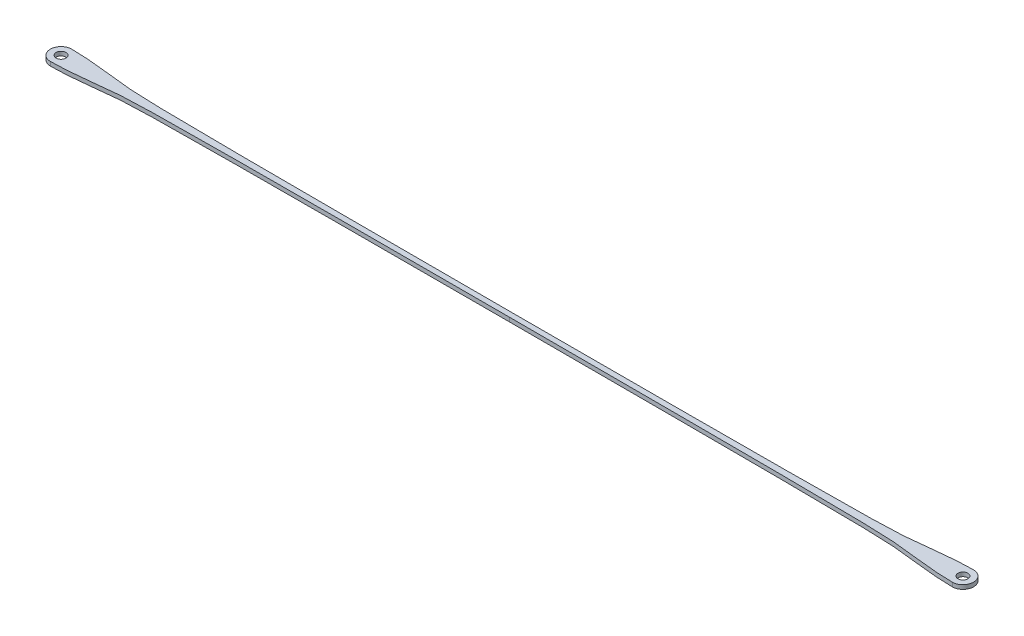
ISO-10303-21;
HEADER;
FILE_DESCRIPTION(('STEP AP214'),'2;1');
FILE_NAME('part.step','',(''),(''),'','','');
FILE_SCHEMA(('AUTOMOTIVE_DESIGN { 1 0 10303 214 1 1 1 1 }'));
ENDSEC;
DATA;
#1=APPLICATION_CONTEXT('core data for automotive mechanical design processes');
#2=APPLICATION_PROTOCOL_DEFINITION('international standard','automotive_design',2000,#1);
#3=PRODUCT_CONTEXT('',#1,'mechanical');
#4=PRODUCT('Part','Part','',(#3));
#5=PRODUCT_RELATED_PRODUCT_CATEGORY('part','',(#4));
#6=PRODUCT_DEFINITION_FORMATION('','',#4);
#7=PRODUCT_DEFINITION_CONTEXT('part definition',#1,'design');
#8=PRODUCT_DEFINITION('design','',#6,#7);
#9=PRODUCT_DEFINITION_SHAPE('','',#8);
#10=(LENGTH_UNIT() NAMED_UNIT(*) SI_UNIT(.MILLI.,.METRE.));
#11=(NAMED_UNIT(*) PLANE_ANGLE_UNIT() SI_UNIT($,.RADIAN.));
#12=(NAMED_UNIT(*) SI_UNIT($,.STERADIAN.) SOLID_ANGLE_UNIT());
#13=UNCERTAINTY_MEASURE_WITH_UNIT(LENGTH_MEASURE(1.E-05),#10,'distance_accuracy_value','');
#14=(GEOMETRIC_REPRESENTATION_CONTEXT(3) GLOBAL_UNCERTAINTY_ASSIGNED_CONTEXT((#13)) GLOBAL_UNIT_ASSIGNED_CONTEXT((#10,
#11,#12)) REPRESENTATION_CONTEXT('',''));
#15=CARTESIAN_POINT('',(0.,0.,0.));
#16=DIRECTION('',(0.,0.,1.));
#17=DIRECTION('',(1.,0.,0.));
#18=AXIS2_PLACEMENT_3D('',#15,#16,#17);
#19=CARTESIAN_POINT('',(0.,0.5,1.30000507237961));
#20=CARTESIAN_POINT('',(2.1582956686711,0.5,1.30000507237961));
#21=CARTESIAN_POINT('',(7.53255802652431,0.5,0.546418398062768));
#22=CARTESIAN_POINT('',(11.223513642314,0.5,0.328258620123109));
#23=CARTESIAN_POINT('',(55.,0.5,0.319066310254357));
#24=B_SPLINE_CURVE_WITH_KNOTS('',3,(#19,#20,#21,#22,#23),.UNSPECIFIED.,.F.,.F.,(4,1,4),(0.,
0.427834461323006,1.),.UNSPECIFIED.);
#25=DIRECTION('',(0.,-1.,0.));
#26=VECTOR('',#25,1.);
#27=SURFACE_OF_LINEAR_EXTRUSION('',#24,#26);
#28=CARTESIAN_POINT('',(0.,0.,1.30000507237961));
#29=CARTESIAN_POINT('',(2.1582956686711,0.,1.30000507237961));
#30=CARTESIAN_POINT('',(7.53255802652431,0.,0.546418398062768));
#31=CARTESIAN_POINT('',(11.223513642314,0.,0.328258620123109));
#32=CARTESIAN_POINT('',(55.,0.,0.319066310254357));
#33=B_SPLINE_CURVE_WITH_KNOTS('',3,(#28,#29,#30,#31,#32),.UNSPECIFIED.,.F.,.F.,(4,1,4),(0.,
0.427834461323006,1.),.UNSPECIFIED.);
#34=CARTESIAN_POINT('',(0.,0.,1.30000507237961));
#35=VERTEX_POINT('',#34);
#36=CARTESIAN_POINT('',(55.,0.,0.319066310254357));
#37=VERTEX_POINT('',#36);
#38=EDGE_CURVE('E230',#35,#37,#33,.T.);
#39=ORIENTED_EDGE('',*,*,#38,.T.);
#40=DIRECTION('',(0.,-1.,0.));
#41=VECTOR('',#40,1.);
#42=CARTESIAN_POINT('',(55.,0.5,0.319066310254357));
#43=LINE('',#42,#41);
#44=CARTESIAN_POINT('',(55.,0.5,0.319066310254357));
#45=VERTEX_POINT('',#44);
#46=EDGE_CURVE('E102',#45,#37,#43,.T.);
#47=ORIENTED_EDGE('',*,*,#46,.F.);
#48=CARTESIAN_POINT('',(0.,0.5,1.30000507237961));
#49=VERTEX_POINT('',#48);
#50=EDGE_CURVE('E225',#49,#45,#24,.T.);
#51=ORIENTED_EDGE('',*,*,#50,.F.);
#52=DIRECTION('',(0.,-1.,0.));
#53=VECTOR('',#52,1.);
#54=CARTESIAN_POINT('',(0.,0.5,1.30000507237961));
#55=LINE('',#54,#53);
#56=EDGE_CURVE('E12',#49,#35,#55,.T.);
#57=ORIENTED_EDGE('',*,*,#56,.T.);
#58=EDGE_LOOP('',(#39,#47,#51,#57));
#59=FACE_BOUND('',#58,.T.);
#60=ADVANCED_FACE('F91',(#59),#27,.F.);
#61=CARTESIAN_POINT('',(0.,0.5,-1.30000507237961));
#62=CARTESIAN_POINT('',(2.1582956686711,0.5,-1.30000507237961));
#63=CARTESIAN_POINT('',(7.5325580265243,0.5,-0.546418398062768));
#64=CARTESIAN_POINT('',(11.223513642314,0.5,-0.32825862012311));
#65=CARTESIAN_POINT('',(55.,0.5,-0.319066310254357));
#66=B_SPLINE_CURVE_WITH_KNOTS('',3,(#61,#62,#63,#64,#65),.UNSPECIFIED.,.F.,.F.,(4,1,4),(0.,
0.427834461323006,1.),.UNSPECIFIED.);
#67=DIRECTION('',(0.,-1.,0.));
#68=VECTOR('',#67,1.);
#69=SURFACE_OF_LINEAR_EXTRUSION('',#66,#68);
#70=CARTESIAN_POINT('',(0.,0.,-1.30000507237961));
#71=CARTESIAN_POINT('',(2.1582956686711,0.,-1.30000507237961));
#72=CARTESIAN_POINT('',(7.5325580265243,0.,-0.546418398062768));
#73=CARTESIAN_POINT('',(11.223513642314,0.,-0.32825862012311));
#74=CARTESIAN_POINT('',(55.,0.,-0.319066310254357));
#75=B_SPLINE_CURVE_WITH_KNOTS('',3,(#70,#71,#72,#73,#74),.UNSPECIFIED.,.F.,.F.,(4,1,4),(0.,
0.427834461323006,1.),.UNSPECIFIED.);
#76=CARTESIAN_POINT('',(0.,0.,-1.30000507237961));
#77=VERTEX_POINT('',#76);
#78=CARTESIAN_POINT('',(55.,0.,-0.319066310254357));
#79=VERTEX_POINT('',#78);
#80=EDGE_CURVE('E169',#77,#79,#75,.T.);
#81=ORIENTED_EDGE('',*,*,#80,.F.);
#82=DIRECTION('',(0.,-1.,0.));
#83=VECTOR('',#82,1.);
#84=CARTESIAN_POINT('',(0.,0.5,-1.30000507237961));
#85=LINE('',#84,#83);
#86=CARTESIAN_POINT('',(0.,0.5,-1.30000507237961));
#87=VERTEX_POINT('',#86);
#88=EDGE_CURVE('E111',#87,#77,#85,.T.);
#89=ORIENTED_EDGE('',*,*,#88,.F.);
#90=CARTESIAN_POINT('',(55.,0.5,-0.319066310254357));
#91=VERTEX_POINT('',#90);
#92=EDGE_CURVE('E219',#87,#91,#66,.T.);
#93=ORIENTED_EDGE('',*,*,#92,.T.);
#94=DIRECTION('',(0.,-1.,0.));
#95=VECTOR('',#94,1.);
#96=CARTESIAN_POINT('',(55.,0.5,-0.319066310254357));
#97=LINE('',#96,#95);
#98=EDGE_CURVE('E122',#91,#79,#97,.T.);
#99=ORIENTED_EDGE('',*,*,#98,.T.);
#100=EDGE_LOOP('',(#81,#89,#93,#99));
#101=FACE_BOUND('',#100,.T.);
#102=ADVANCED_FACE('F214',(#101),#69,.T.);
#103=CARTESIAN_POINT('',(0.,0.,0.));
#104=DIRECTION('',(0.,1.,0.));
#105=DIRECTION('',(0.,0.,1.));
#106=AXIS2_PLACEMENT_3D('',#103,#104,#105);
#107=PLANE('',#106);
#108=CARTESIAN_POINT('',(110.,0.,0.));
#109=DIRECTION('',(0.,1.,0.));
#110=DIRECTION('',(0.,0.,1.));
#111=AXIS2_PLACEMENT_3D('',#108,#109,#110);
#112=CIRCLE('',#111,0.6);
#113=CARTESIAN_POINT('',(110.,0.,0.6));
#114=VERTEX_POINT('',#113);
#115=EDGE_CURVE('E177',#114,#114,#112,.F.);
#116=ORIENTED_EDGE('',*,*,#115,.F.);
#117=EDGE_LOOP('',(#116));
#118=FACE_BOUND('',#117,.T.);
#119=CARTESIAN_POINT('',(0.,0.,0.));
#120=DIRECTION('',(0.,1.,0.));
#121=DIRECTION('',(0.,0.,1.));
#122=AXIS2_PLACEMENT_3D('',#119,#120,#121);
#123=CIRCLE('',#122,0.6);
#124=CARTESIAN_POINT('',(0.,0.,0.6));
#125=VERTEX_POINT('',#124);
#126=EDGE_CURVE('E260',#125,#125,#123,.T.);
#127=ORIENTED_EDGE('',*,*,#126,.T.);
#128=EDGE_LOOP('',(#127));
#129=FACE_BOUND('',#128,.T.);
#130=ORIENTED_EDGE('',*,*,#38,.F.);
#131=CARTESIAN_POINT('',(0.,0.,0.));
#132=DIRECTION('',(0.,1.,0.));
#133=DIRECTION('',(0.,0.,1.));
#134=AXIS2_PLACEMENT_3D('',#131,#132,#133);
#135=CIRCLE('',#134,1.30000507237961);
#136=EDGE_CURVE('E95',#77,#35,#135,.T.);
#137=ORIENTED_EDGE('',*,*,#136,.F.);
#138=ORIENTED_EDGE('',*,*,#80,.T.);
#139=CARTESIAN_POINT('',(110.,0.,-1.30000507237961));
#140=CARTESIAN_POINT('',(107.841704331329,0.,-1.30000507237961));
#141=CARTESIAN_POINT('',(102.467441973476,0.,-0.546418398062768));
#142=CARTESIAN_POINT('',(98.776486357686,0.,-0.32825862012311));
#143=CARTESIAN_POINT('',(55.,0.,-0.319066310254357));
#144=B_SPLINE_CURVE_WITH_KNOTS('',3,(#139,#140,#141,#142,#143),.UNSPECIFIED.,.F.,.F.,(4,1,4),
(0.,0.427834461323006,1.),.UNSPECIFIED.);
#145=CARTESIAN_POINT('',(110.,0.,-1.30000507237961));
#146=VERTEX_POINT('',#145);
#147=EDGE_CURVE('E152',#146,#79,#144,.T.);
#148=ORIENTED_EDGE('',*,*,#147,.F.);
#149=CARTESIAN_POINT('',(110.,0.,0.));
#150=DIRECTION('',(0.,-1.,0.));
#151=DIRECTION('',(0.,0.,1.));
#152=AXIS2_PLACEMENT_3D('',#149,#150,#151);
#153=CIRCLE('',#152,1.30000507237961);
#154=CARTESIAN_POINT('',(110.,0.,1.30000507237961));
#155=VERTEX_POINT('',#154);
#156=EDGE_CURVE('E168',#146,#155,#153,.T.);
#157=ORIENTED_EDGE('',*,*,#156,.T.);
#158=CARTESIAN_POINT('',(110.,0.,1.30000507237961));
#159=CARTESIAN_POINT('',(107.841704331329,0.,1.30000507237961));
#160=CARTESIAN_POINT('',(102.467441973476,0.,0.546418398062768));
#161=CARTESIAN_POINT('',(98.776486357686,0.,0.328258620123109));
#162=CARTESIAN_POINT('',(55.,0.,0.319066310254357));
#163=B_SPLINE_CURVE_WITH_KNOTS('',3,(#158,#159,#160,#161,#162),.UNSPECIFIED.,.F.,.F.,(4,1,4),
(0.,0.427834461323006,1.),.UNSPECIFIED.);
#164=EDGE_CURVE('E171',#155,#37,#163,.T.);
#165=ORIENTED_EDGE('',*,*,#164,.T.);
#166=EDGE_LOOP('',(#130,#137,#138,#148,#157,#165));
#167=FACE_BOUND('',#166,.T.);
#168=ADVANCED_FACE('F166',(#118,#129,#167),#107,.F.);
#169=CARTESIAN_POINT('',(0.,0.5,0.));
#170=DIRECTION('',(0.,1.,0.));
#171=DIRECTION('',(0.,0.,1.));
#172=AXIS2_PLACEMENT_3D('',#169,#170,#171);
#173=PLANE('',#172);
#174=CARTESIAN_POINT('',(110.,0.5,0.));
#175=DIRECTION('',(0.,-1.,0.));
#176=DIRECTION('',(0.,0.,1.));
#177=AXIS2_PLACEMENT_3D('',#174,#175,#176);
#178=CIRCLE('',#177,0.6);
#179=CARTESIAN_POINT('',(110.,0.5,0.6));
#180=VERTEX_POINT('',#179);
#181=EDGE_CURVE('E183',#180,#180,#178,.T.);
#182=ORIENTED_EDGE('',*,*,#181,.T.);
#183=EDGE_LOOP('',(#182));
#184=FACE_BOUND('',#183,.T.);
#185=CARTESIAN_POINT('',(0.,0.5,0.));
#186=DIRECTION('',(0.,1.,0.));
#187=DIRECTION('',(0.,0.,1.));
#188=AXIS2_PLACEMENT_3D('',#185,#186,#187);
#189=CIRCLE('',#188,0.6);
#190=CARTESIAN_POINT('',(0.,0.5,0.6));
#191=VERTEX_POINT('',#190);
#192=EDGE_CURVE('E160',#191,#191,#189,.T.);
#193=ORIENTED_EDGE('',*,*,#192,.F.);
#194=EDGE_LOOP('',(#193));
#195=FACE_BOUND('',#194,.T.);
#196=ORIENTED_EDGE('',*,*,#92,.F.);
#197=CARTESIAN_POINT('',(0.,0.5,0.));
#198=DIRECTION('',(0.,1.,0.));
#199=DIRECTION('',(0.,0.,1.));
#200=AXIS2_PLACEMENT_3D('',#197,#198,#199);
#201=CIRCLE('',#200,1.30000507237961);
#202=EDGE_CURVE('E238',#87,#49,#201,.T.);
#203=ORIENTED_EDGE('',*,*,#202,.T.);
#204=ORIENTED_EDGE('',*,*,#50,.T.);
#205=CARTESIAN_POINT('',(110.,0.5,1.30000507237961));
#206=CARTESIAN_POINT('',(107.841704331329,0.5,1.30000507237961));
#207=CARTESIAN_POINT('',(102.467441973476,0.5,0.546418398062768));
#208=CARTESIAN_POINT('',(98.776486357686,0.5,0.328258620123109));
#209=CARTESIAN_POINT('',(55.,0.5,0.319066310254357));
#210=B_SPLINE_CURVE_WITH_KNOTS('',3,(#205,#206,#207,#208,#209),.UNSPECIFIED.,.F.,.F.,(4,1,4),
(0.,0.427834461323006,1.),.UNSPECIFIED.);
#211=CARTESIAN_POINT('',(110.,0.5,1.30000507237961));
#212=VERTEX_POINT('',#211);
#213=EDGE_CURVE('E191',#212,#45,#210,.T.);
#214=ORIENTED_EDGE('',*,*,#213,.F.);
#215=CARTESIAN_POINT('',(110.,0.5,0.));
#216=DIRECTION('',(0.,-1.,0.));
#217=DIRECTION('',(0.,0.,1.));
#218=AXIS2_PLACEMENT_3D('',#215,#216,#217);
#219=CIRCLE('',#218,1.30000507237961);
#220=CARTESIAN_POINT('',(110.,0.5,-1.30000507237961));
#221=VERTEX_POINT('',#220);
#222=EDGE_CURVE('E172',#221,#212,#219,.T.);
#223=ORIENTED_EDGE('',*,*,#222,.F.);
#224=CARTESIAN_POINT('',(110.,0.5,-1.30000507237961));
#225=CARTESIAN_POINT('',(107.841704331329,0.5,-1.30000507237961));
#226=CARTESIAN_POINT('',(102.467441973476,0.5,-0.546418398062768));
#227=CARTESIAN_POINT('',(98.776486357686,0.5,-0.32825862012311));
#228=CARTESIAN_POINT('',(55.,0.5,-0.319066310254357));
#229=B_SPLINE_CURVE_WITH_KNOTS('',3,(#224,#225,#226,#227,#228),.UNSPECIFIED.,.F.,.F.,(4,1,4),
(0.,0.427834461323006,1.),.UNSPECIFIED.);
#230=EDGE_CURVE('E154',#221,#91,#229,.T.);
#231=ORIENTED_EDGE('',*,*,#230,.T.);
#232=EDGE_LOOP('',(#196,#203,#204,#214,#223,#231));
#233=FACE_BOUND('',#232,.T.);
#234=ADVANCED_FACE('F208',(#184,#195,#233),#173,.T.);
#235=CARTESIAN_POINT('',(0.,0.5,0.));
#236=DIRECTION('',(0.,-1.,0.));
#237=DIRECTION('',(0.,0.,-1.));
#238=AXIS2_PLACEMENT_3D('',#235,#236,#237);
#239=CYLINDRICAL_SURFACE('',#238,1.30000507237961);
#240=ORIENTED_EDGE('',*,*,#56,.F.);
#241=ORIENTED_EDGE('',*,*,#202,.F.);
#242=ORIENTED_EDGE('',*,*,#88,.T.);
#243=ORIENTED_EDGE('',*,*,#136,.T.);
#244=EDGE_LOOP('',(#240,#241,#242,#243));
#245=FACE_BOUND('',#244,.T.);
#246=ADVANCED_FACE('F93',(#245),#239,.T.);
#247=CARTESIAN_POINT('',(0.,-0.5,0.));
#248=DIRECTION('',(0.,1.,0.));
#249=DIRECTION('',(0.,0.,1.));
#250=AXIS2_PLACEMENT_3D('',#247,#248,#249);
#251=CYLINDRICAL_SURFACE('',#250,0.6);
#252=ORIENTED_EDGE('',*,*,#192,.T.);
#253=EDGE_LOOP('',(#252));
#254=FACE_BOUND('',#253,.T.);
#255=ORIENTED_EDGE('',*,*,#126,.F.);
#256=EDGE_LOOP('',(#255));
#257=FACE_BOUND('',#256,.T.);
#258=ADVANCED_FACE('F203',(#254,#257),#251,.F.);
#259=DIRECTION('',(0.,-1.,0.));
#260=VECTOR('',#259,1.);
#261=SURFACE_OF_LINEAR_EXTRUSION('',#229,#260);
#262=ORIENTED_EDGE('',*,*,#147,.T.);
#263=ORIENTED_EDGE('',*,*,#98,.F.);
#264=ORIENTED_EDGE('',*,*,#230,.F.);
#265=DIRECTION('',(0.,-1.,0.));
#266=VECTOR('',#265,1.);
#267=CARTESIAN_POINT('',(110.,0.5,-1.30000507237961));
#268=LINE('',#267,#266);
#269=EDGE_CURVE('E149',#221,#146,#268,.T.);
#270=ORIENTED_EDGE('',*,*,#269,.T.);
#271=EDGE_LOOP('',(#262,#263,#264,#270));
#272=FACE_BOUND('',#271,.T.);
#273=ADVANCED_FACE('F151',(#272),#261,.F.);
#274=DIRECTION('',(0.,-1.,0.));
#275=VECTOR('',#274,1.);
#276=SURFACE_OF_LINEAR_EXTRUSION('',#210,#275);
#277=ORIENTED_EDGE('',*,*,#164,.F.);
#278=DIRECTION('',(0.,-1.,0.));
#279=VECTOR('',#278,1.);
#280=CARTESIAN_POINT('',(110.,0.5,1.30000507237961));
#281=LINE('',#280,#279);
#282=EDGE_CURVE('E161',#212,#155,#281,.T.);
#283=ORIENTED_EDGE('',*,*,#282,.F.);
#284=ORIENTED_EDGE('',*,*,#213,.T.);
#285=ORIENTED_EDGE('',*,*,#46,.T.);
#286=EDGE_LOOP('',(#277,#283,#284,#285));
#287=FACE_BOUND('',#286,.T.);
#288=ADVANCED_FACE('F202',(#287),#276,.T.);
#289=CARTESIAN_POINT('',(110.,0.5,0.));
#290=DIRECTION('',(0.,-1.,0.));
#291=DIRECTION('',(0.,0.,-1.));
#292=AXIS2_PLACEMENT_3D('',#289,#290,#291);
#293=CYLINDRICAL_SURFACE('',#292,1.30000507237961);
#294=ORIENTED_EDGE('',*,*,#269,.F.);
#295=ORIENTED_EDGE('',*,*,#222,.T.);
#296=ORIENTED_EDGE('',*,*,#282,.T.);
#297=ORIENTED_EDGE('',*,*,#156,.F.);
#298=EDGE_LOOP('',(#294,#295,#296,#297));
#299=FACE_BOUND('',#298,.T.);
#300=ADVANCED_FACE('F175',(#299),#293,.T.);
#301=CARTESIAN_POINT('',(110.,-0.5,0.));
#302=DIRECTION('',(0.,1.,0.));
#303=DIRECTION('',(0.,0.,1.));
#304=AXIS2_PLACEMENT_3D('',#301,#302,#303);
#305=CYLINDRICAL_SURFACE('',#304,0.6);
#306=ORIENTED_EDGE('',*,*,#181,.F.);
#307=EDGE_LOOP('',(#306));
#308=FACE_BOUND('',#307,.T.);
#309=ORIENTED_EDGE('',*,*,#115,.T.);
#310=EDGE_LOOP('',(#309));
#311=FACE_BOUND('',#310,.T.);
#312=ADVANCED_FACE('F328',(#308,#311),#305,.F.);
#313=CLOSED_SHELL('',(#60,#102,#168,#234,#246,#258,#273,#288,#300,#312));
#314=MANIFOLD_SOLID_BREP('B2',#313);
#315=ADVANCED_BREP_SHAPE_REPRESENTATION('',(#18,#314),#14);
#316=SHAPE_DEFINITION_REPRESENTATION(#9,#315);
ENDSEC;
END-ISO-10303-21;
